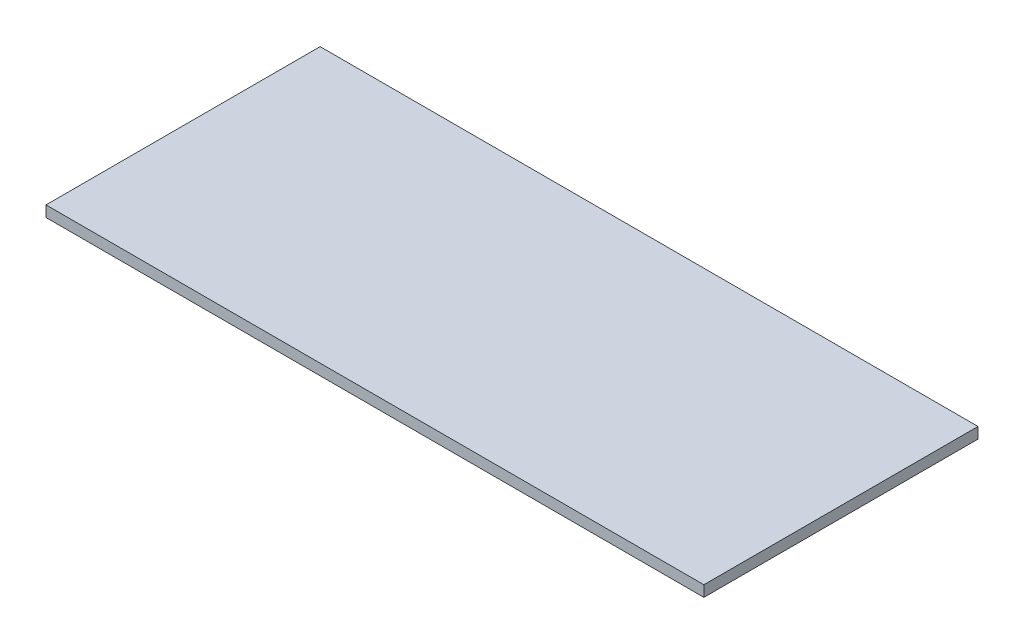
ISO-10303-21;
HEADER;
FILE_DESCRIPTION(('STEP AP214'),'2;1');
FILE_NAME('part.step','',(''),(''),'','','');
FILE_SCHEMA(('AUTOMOTIVE_DESIGN { 1 0 10303 214 1 1 1 1 }'));
ENDSEC;
DATA;
#1=APPLICATION_CONTEXT('core data for automotive mechanical design processes');
#2=APPLICATION_PROTOCOL_DEFINITION('international standard','automotive_design',2000,#1);
#3=PRODUCT_CONTEXT('',#1,'mechanical');
#4=PRODUCT('Part','Part','',(#3));
#5=PRODUCT_RELATED_PRODUCT_CATEGORY('part','',(#4));
#6=PRODUCT_DEFINITION_FORMATION('','',#4);
#7=PRODUCT_DEFINITION_CONTEXT('part definition',#1,'design');
#8=PRODUCT_DEFINITION('design','',#6,#7);
#9=PRODUCT_DEFINITION_SHAPE('','',#8);
#10=(LENGTH_UNIT() NAMED_UNIT(*) SI_UNIT(.MILLI.,.METRE.));
#11=(NAMED_UNIT(*) PLANE_ANGLE_UNIT() SI_UNIT($,.RADIAN.));
#12=(NAMED_UNIT(*) SI_UNIT($,.STERADIAN.) SOLID_ANGLE_UNIT());
#13=UNCERTAINTY_MEASURE_WITH_UNIT(LENGTH_MEASURE(1.E-05),#10,'distance_accuracy_value','');
#14=(GEOMETRIC_REPRESENTATION_CONTEXT(3) GLOBAL_UNCERTAINTY_ASSIGNED_CONTEXT((#13)) GLOBAL_UNIT_ASSIGNED_CONTEXT((#10,
#11,#12)) REPRESENTATION_CONTEXT('',''));
#15=CARTESIAN_POINT('',(0.,0.,0.));
#16=DIRECTION('',(0.,0.,1.));
#17=DIRECTION('',(1.,0.,0.));
#18=AXIS2_PLACEMENT_3D('',#15,#16,#17);
#19=CARTESIAN_POINT('',(300.,10.,-125.));
#20=DIRECTION('',(-1.,0.,0.));
#21=DIRECTION('',(0.,0.,1.));
#22=AXIS2_PLACEMENT_3D('',#19,#20,#21);
#23=PLANE('',#22);
#24=DIRECTION('',(0.,0.,-1.));
#25=VECTOR('',#24,1.);
#26=CARTESIAN_POINT('',(300.,0.,-125.));
#27=LINE('',#26,#25);
#28=CARTESIAN_POINT('',(300.,0.,125.));
#29=VERTEX_POINT('',#28);
#30=CARTESIAN_POINT('',(300.,0.,-125.));
#31=VERTEX_POINT('',#30);
#32=EDGE_CURVE('E97',#29,#31,#27,.T.);
#33=ORIENTED_EDGE('',*,*,#32,.T.);
#34=DIRECTION('',(0.,-1.,0.));
#35=VECTOR('',#34,1.);
#36=CARTESIAN_POINT('',(300.,10.,-125.));
#37=LINE('',#36,#35);
#38=CARTESIAN_POINT('',(300.,10.,-125.));
#39=VERTEX_POINT('',#38);
#40=EDGE_CURVE('E11',#39,#31,#37,.T.);
#41=ORIENTED_EDGE('',*,*,#40,.F.);
#42=DIRECTION('',(0.,0.,-1.));
#43=VECTOR('',#42,1.);
#44=CARTESIAN_POINT('',(300.,10.,-125.));
#45=LINE('',#44,#43);
#46=CARTESIAN_POINT('',(300.,10.,125.));
#47=VERTEX_POINT('',#46);
#48=EDGE_CURVE('E85',#47,#39,#45,.T.);
#49=ORIENTED_EDGE('',*,*,#48,.F.);
#50=DIRECTION('',(0.,-1.,0.));
#51=VECTOR('',#50,1.);
#52=CARTESIAN_POINT('',(300.,10.,125.));
#53=LINE('',#52,#51);
#54=EDGE_CURVE('E93',#47,#29,#53,.T.);
#55=ORIENTED_EDGE('',*,*,#54,.T.);
#56=EDGE_LOOP('',(#33,#41,#49,#55));
#57=FACE_BOUND('',#56,.T.);
#58=ADVANCED_FACE('F34',(#57),#23,.F.);
#59=CARTESIAN_POINT('',(-300.,10.,-125.));
#60=DIRECTION('',(0.,0.,1.));
#61=DIRECTION('',(1.,0.,0.));
#62=AXIS2_PLACEMENT_3D('',#59,#60,#61);
#63=PLANE('',#62);
#64=DIRECTION('',(-1.,0.,0.));
#65=VECTOR('',#64,1.);
#66=CARTESIAN_POINT('',(-300.,0.,-125.));
#67=LINE('',#66,#65);
#68=CARTESIAN_POINT('',(-300.,0.,-125.));
#69=VERTEX_POINT('',#68);
#70=EDGE_CURVE('E89',#31,#69,#67,.T.);
#71=ORIENTED_EDGE('',*,*,#70,.T.);
#72=DIRECTION('',(0.,-1.,0.));
#73=VECTOR('',#72,1.);
#74=CARTESIAN_POINT('',(-300.,10.,-125.));
#75=LINE('',#74,#73);
#76=CARTESIAN_POINT('',(-300.,10.,-125.));
#77=VERTEX_POINT('',#76);
#78=EDGE_CURVE('E42',#77,#69,#75,.T.);
#79=ORIENTED_EDGE('',*,*,#78,.F.);
#80=DIRECTION('',(-1.,0.,0.));
#81=VECTOR('',#80,1.);
#82=CARTESIAN_POINT('',(-300.,10.,-125.));
#83=LINE('',#82,#81);
#84=EDGE_CURVE('E80',#39,#77,#83,.T.);
#85=ORIENTED_EDGE('',*,*,#84,.F.);
#86=ORIENTED_EDGE('',*,*,#40,.T.);
#87=EDGE_LOOP('',(#71,#79,#85,#86));
#88=FACE_BOUND('',#87,.T.);
#89=ADVANCED_FACE('F88',(#88),#63,.F.);
#90=CARTESIAN_POINT('',(-300.,10.,-125.));
#91=DIRECTION('',(1.,0.,0.));
#92=DIRECTION('',(0.,0.,-1.));
#93=AXIS2_PLACEMENT_3D('',#90,#91,#92);
#94=PLANE('',#93);
#95=DIRECTION('',(0.,0.,1.));
#96=VECTOR('',#95,1.);
#97=CARTESIAN_POINT('',(-300.,0.,-125.));
#98=LINE('',#97,#96);
#99=CARTESIAN_POINT('',(-300.,0.,125.));
#100=VERTEX_POINT('',#99);
#101=EDGE_CURVE('E67',#69,#100,#98,.T.);
#102=ORIENTED_EDGE('',*,*,#101,.T.);
#103=DIRECTION('',(0.,-1.,0.));
#104=VECTOR('',#103,1.);
#105=CARTESIAN_POINT('',(-300.,10.,125.));
#106=LINE('',#105,#104);
#107=CARTESIAN_POINT('',(-300.,10.,125.));
#108=VERTEX_POINT('',#107);
#109=EDGE_CURVE('E90',#108,#100,#106,.T.);
#110=ORIENTED_EDGE('',*,*,#109,.F.);
#111=DIRECTION('',(0.,0.,1.));
#112=VECTOR('',#111,1.);
#113=CARTESIAN_POINT('',(-300.,10.,-125.));
#114=LINE('',#113,#112);
#115=EDGE_CURVE('E83',#77,#108,#114,.T.);
#116=ORIENTED_EDGE('',*,*,#115,.F.);
#117=ORIENTED_EDGE('',*,*,#78,.T.);
#118=EDGE_LOOP('',(#102,#110,#116,#117));
#119=FACE_BOUND('',#118,.T.);
#120=ADVANCED_FACE('F91',(#119),#94,.F.);
#121=CARTESIAN_POINT('',(-300.,10.,125.));
#122=DIRECTION('',(0.,0.,-1.));
#123=DIRECTION('',(-1.,0.,0.));
#124=AXIS2_PLACEMENT_3D('',#121,#122,#123);
#125=PLANE('',#124);
#126=DIRECTION('',(1.,0.,0.));
#127=VECTOR('',#126,1.);
#128=CARTESIAN_POINT('',(-300.,0.,125.));
#129=LINE('',#128,#127);
#130=EDGE_CURVE('E73',#100,#29,#129,.T.);
#131=ORIENTED_EDGE('',*,*,#130,.T.);
#132=ORIENTED_EDGE('',*,*,#54,.F.);
#133=DIRECTION('',(1.,0.,0.));
#134=VECTOR('',#133,1.);
#135=CARTESIAN_POINT('',(-300.,10.,125.));
#136=LINE('',#135,#134);
#137=EDGE_CURVE('E50',#108,#47,#136,.T.);
#138=ORIENTED_EDGE('',*,*,#137,.F.);
#139=ORIENTED_EDGE('',*,*,#109,.T.);
#140=EDGE_LOOP('',(#131,#132,#138,#139));
#141=FACE_BOUND('',#140,.T.);
#142=ADVANCED_FACE('F104',(#141),#125,.F.);
#143=CARTESIAN_POINT('',(0.,10.,0.));
#144=DIRECTION('',(0.,1.,0.));
#145=DIRECTION('',(0.,0.,1.));
#146=AXIS2_PLACEMENT_3D('',#143,#144,#145);
#147=PLANE('',#146);
#148=ORIENTED_EDGE('',*,*,#48,.T.);
#149=ORIENTED_EDGE('',*,*,#84,.T.);
#150=ORIENTED_EDGE('',*,*,#115,.T.);
#151=ORIENTED_EDGE('',*,*,#137,.T.);
#152=EDGE_LOOP('',(#148,#149,#150,#151));
#153=FACE_BOUND('',#152,.T.);
#154=ADVANCED_FACE('F81',(#153),#147,.T.);
#155=CARTESIAN_POINT('',(0.,0.,0.));
#156=DIRECTION('',(0.,1.,0.));
#157=DIRECTION('',(0.,0.,1.));
#158=AXIS2_PLACEMENT_3D('',#155,#156,#157);
#159=PLANE('',#158);
#160=ORIENTED_EDGE('',*,*,#32,.F.);
#161=ORIENTED_EDGE('',*,*,#130,.F.);
#162=ORIENTED_EDGE('',*,*,#101,.F.);
#163=ORIENTED_EDGE('',*,*,#70,.F.);
#164=EDGE_LOOP('',(#160,#161,#162,#163));
#165=FACE_BOUND('',#164,.T.);
#166=ADVANCED_FACE('F107',(#165),#159,.F.);
#167=CLOSED_SHELL('',(#58,#89,#120,#142,#154,#166));
#168=MANIFOLD_SOLID_BREP('B2',#167);
#169=ADVANCED_BREP_SHAPE_REPRESENTATION('',(#18,#168),#14);
#170=SHAPE_DEFINITION_REPRESENTATION(#9,#169);
ENDSEC;
END-ISO-10303-21;
